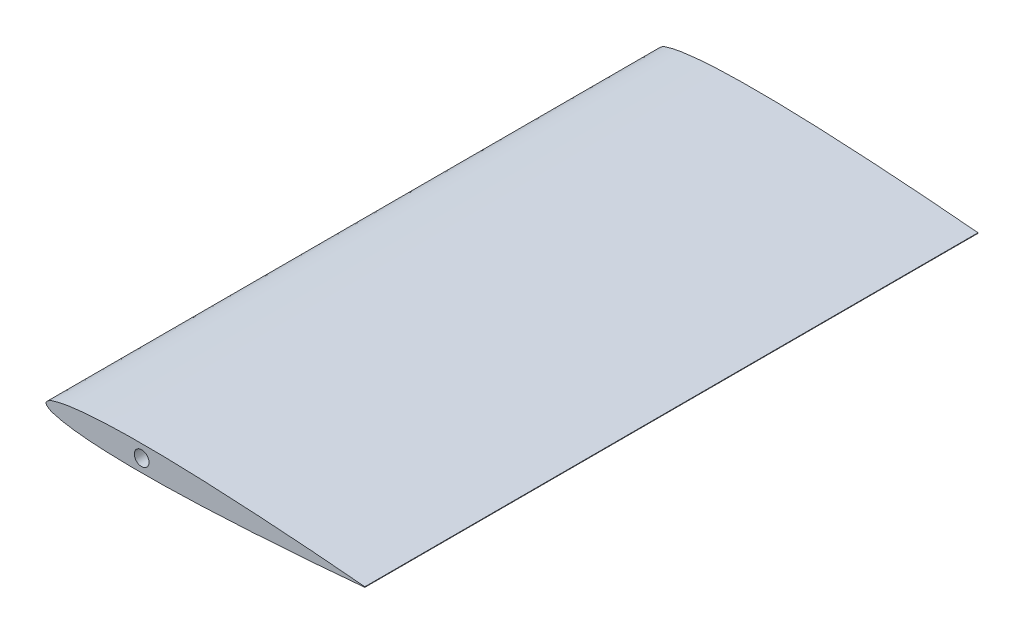
ISO-10303-21;
HEADER;
FILE_DESCRIPTION(('STEP AP214'),'2;1');
FILE_NAME('part.step','',(''),(''),'','','');
FILE_SCHEMA(('AUTOMOTIVE_DESIGN { 1 0 10303 214 1 1 1 1 }'));
ENDSEC;
DATA;
#1=APPLICATION_CONTEXT('core data for automotive mechanical design processes');
#2=APPLICATION_PROTOCOL_DEFINITION('international standard','automotive_design',2000,#1);
#3=PRODUCT_CONTEXT('',#1,'mechanical');
#4=PRODUCT('Part','Part','',(#3));
#5=PRODUCT_RELATED_PRODUCT_CATEGORY('part','',(#4));
#6=PRODUCT_DEFINITION_FORMATION('','',#4);
#7=PRODUCT_DEFINITION_CONTEXT('part definition',#1,'design');
#8=PRODUCT_DEFINITION('design','',#6,#7);
#9=PRODUCT_DEFINITION_SHAPE('','',#8);
#10=(LENGTH_UNIT() NAMED_UNIT(*) SI_UNIT(.MILLI.,.METRE.));
#11=(NAMED_UNIT(*) PLANE_ANGLE_UNIT() SI_UNIT($,.RADIAN.));
#12=(NAMED_UNIT(*) SI_UNIT($,.STERADIAN.) SOLID_ANGLE_UNIT());
#13=UNCERTAINTY_MEASURE_WITH_UNIT(LENGTH_MEASURE(1.E-05),#10,'distance_accuracy_value','');
#14=(GEOMETRIC_REPRESENTATION_CONTEXT(3) GLOBAL_UNCERTAINTY_ASSIGNED_CONTEXT((#13)) GLOBAL_UNIT_ASSIGNED_CONTEXT((#10,
#11,#12)) REPRESENTATION_CONTEXT('',''));
#15=CARTESIAN_POINT('',(0.,0.,0.));
#16=DIRECTION('',(0.,0.,1.));
#17=DIRECTION('',(1.,0.,0.));
#18=AXIS2_PLACEMENT_3D('',#15,#16,#17);
#19=CARTESIAN_POINT('',(0.,0.,250.));
#20=DIRECTION('',(0.,0.,-1.));
#21=DIRECTION('',(-1.,0.,0.));
#22=AXIS2_PLACEMENT_3D('',#19,#20,#21);
#23=PLANE('',#22);
#24=CARTESIAN_POINT('',(130.,0.1092,250.));
#25=CARTESIAN_POINT('',(127.833535732673,0.307773960495471,250.));
#26=CARTESIAN_POINT('',(123.501553962715,0.70483510284993,250.));
#27=CARTESIAN_POINT('',(114.836215077916,1.4441092804009,250.));
#28=CARTESIAN_POINT('',(104.004308011327,2.29318220094174,250.));
#29=CARTESIAN_POINT('',(91.0038872870488,3.19523180319484,250.));
#30=CARTESIAN_POINT('',(78.0040316316683,3.98033953875171,250.));
#31=CARTESIAN_POINT('',(65.0039160190168,4.61810045351935,250.));
#32=CARTESIAN_POINT('',(52.0033851771133,5.07428379972299,250.));
#33=CARTESIAN_POINT('',(41.1670398833176,5.23263615462631,250.));
#34=CARTESIAN_POINT('',(32.498919095683,5.16938699199426,250.));
#35=CARTESIAN_POINT('',(25.9970698378604,4.99948673038458,250.));
#36=CARTESIAN_POINT('',(19.4913883897994,4.66978492459391,250.));
#37=CARTESIAN_POINT('',(14.0753700513261,4.20851819590792,250.));
#38=CARTESIAN_POINT('',(9.73578572850335,3.65819985102422,250.));
#39=CARTESIAN_POINT('',(6.49160363280204,3.12522619853072,250.));
#40=CARTESIAN_POINT('',(3.704548113085,2.42836025562077,250.));
#41=CARTESIAN_POINT('',(1.51499567764257,1.71739452299827,250.));
#42=CARTESIAN_POINT('',(-0.863985461217163,0.,250.));
#43=CARTESIAN_POINT('',(1.51499567764257,-1.71739452299826,250.));
#44=CARTESIAN_POINT('',(3.70454811308501,-2.42836025562078,250.));
#45=CARTESIAN_POINT('',(6.49160363280201,-3.12522619853071,250.));
#46=CARTESIAN_POINT('',(9.73578572850337,-3.65819985102422,250.));
#47=CARTESIAN_POINT('',(14.0753700513261,-4.20851819590792,250.));
#48=CARTESIAN_POINT('',(19.4913883897994,-4.66978492459391,250.));
#49=CARTESIAN_POINT('',(25.9970698378604,-4.99948673038458,250.));
#50=CARTESIAN_POINT('',(32.4989190956831,-5.16938699199426,250.));
#51=CARTESIAN_POINT('',(41.1670398833176,-5.2326361546263,250.));
#52=CARTESIAN_POINT('',(52.0033851771133,-5.07428379972299,250.));
#53=CARTESIAN_POINT('',(65.0039160190168,-4.61810045351935,250.));
#54=CARTESIAN_POINT('',(78.0040316316683,-3.98033953875171,250.));
#55=CARTESIAN_POINT('',(91.0038872870488,-3.19523180319484,250.));
#56=CARTESIAN_POINT('',(104.004308011327,-2.29318220094174,250.));
#57=CARTESIAN_POINT('',(114.836215077916,-1.4441092804009,250.));
#58=CARTESIAN_POINT('',(123.501553962715,-0.704835102849927,250.));
#59=CARTESIAN_POINT('',(127.833535732673,-0.30777396049547,250.));
#60=CARTESIAN_POINT('',(130.,-0.1092,250.));
#61=B_SPLINE_CURVE_WITH_KNOTS('',3,(#24,#25,#26,#27,#28,#29,#30,#31,#32,#33,#34,#35,#36,#37,#38,
#39,#40,#41,#42,#43,#44,#45,#46,#47,#48,#49,#50,#51,#52,#53,#54,#55,#56,#57,#58,#59,#60),
.UNSPECIFIED.,.F.,.F.,(4,1,1,1,1,1,1,1,1,1,1,1,1,1,1,1,1,1,1,1,1,1,1,1,1,1,1,1,1,1,1,1,1,1,4),
(0.,0.0248762804834874,0.0497416898049367,0.0994434417854954,0.149112186110492,
0.198750911327119,0.24835904696366,0.297937294403623,0.347491196880371,0.372266797678534,
0.397050685977697,0.421859363952799,0.446731256148464,0.459220209986021,0.471790159608865,
0.484560191242022,0.491194845973671,0.5,0.50880515402633,0.515439808757978,0.528209840391136,
0.540779790013979,0.553268743851536,0.578140636047201,0.602949314022304,0.627733202321466,
0.652508803119629,0.702062705596377,0.75164095303634,0.801249088672881,0.850887813889509,
0.900556558214505,0.950258310195063,0.975123719516513,1.),.UNSPECIFIED.);
#62=CARTESIAN_POINT('',(130.,0.1092,250.));
#63=VERTEX_POINT('',#62);
#64=CARTESIAN_POINT('',(130.,-0.1092,250.));
#65=VERTEX_POINT('',#64);
#66=EDGE_CURVE('E65',#63,#65,#61,.T.);
#67=ORIENTED_EDGE('',*,*,#66,.T.);
#68=DIRECTION('',(0.,1.,0.));
#69=VECTOR('',#68,1.);
#70=CARTESIAN_POINT('',(130.,0.1092,250.));
#71=LINE('',#70,#69);
#72=EDGE_CURVE('E50',#65,#63,#71,.T.);
#73=ORIENTED_EDGE('',*,*,#72,.T.);
#74=EDGE_LOOP('',(#67,#73));
#75=FACE_BOUND('',#74,.T.);
#76=CARTESIAN_POINT('',(38.99725692697,0.,250.));
#77=DIRECTION('',(0.,0.,1.));
#78=DIRECTION('',(1.,0.,0.));
#79=AXIS2_PLACEMENT_3D('',#76,#77,#78);
#80=CIRCLE('',#79,3.);
#81=CARTESIAN_POINT('',(41.99725692697,0.,250.));
#82=VERTEX_POINT('',#81);
#83=EDGE_CURVE('E71',#82,#82,#80,.T.);
#84=ORIENTED_EDGE('',*,*,#83,.F.);
#85=EDGE_LOOP('',(#84));
#86=FACE_BOUND('',#85,.T.);
#87=ADVANCED_FACE('F33',(#75,#86),#23,.F.);
#88=CARTESIAN_POINT('',(0.,0.,0.));
#89=DIRECTION('',(0.,0.,-1.));
#90=DIRECTION('',(-1.,0.,0.));
#91=AXIS2_PLACEMENT_3D('',#88,#89,#90);
#92=PLANE('',#91);
#93=CARTESIAN_POINT('',(130.,0.1092,0.));
#94=CARTESIAN_POINT('',(127.833535732673,0.307773960495471,0.));
#95=CARTESIAN_POINT('',(123.501553962715,0.70483510284993,0.));
#96=CARTESIAN_POINT('',(114.836215077916,1.4441092804009,0.));
#97=CARTESIAN_POINT('',(104.004308011327,2.29318220094174,0.));
#98=CARTESIAN_POINT('',(91.0038872870488,3.19523180319484,0.));
#99=CARTESIAN_POINT('',(78.0040316316683,3.98033953875171,0.));
#100=CARTESIAN_POINT('',(65.0039160190168,4.61810045351935,0.));
#101=CARTESIAN_POINT('',(52.0033851771133,5.07428379972299,0.));
#102=CARTESIAN_POINT('',(41.1670398833176,5.23263615462631,0.));
#103=CARTESIAN_POINT('',(32.498919095683,5.16938699199426,0.));
#104=CARTESIAN_POINT('',(25.9970698378604,4.99948673038458,0.));
#105=CARTESIAN_POINT('',(19.4913883897994,4.66978492459391,0.));
#106=CARTESIAN_POINT('',(14.0753700513261,4.20851819590792,0.));
#107=CARTESIAN_POINT('',(9.73578572850335,3.65819985102422,0.));
#108=CARTESIAN_POINT('',(6.49160363280204,3.12522619853072,0.));
#109=CARTESIAN_POINT('',(3.704548113085,2.42836025562077,0.));
#110=CARTESIAN_POINT('',(1.51499567764257,1.71739452299827,0.));
#111=CARTESIAN_POINT('',(-0.863985461217163,0.,0.));
#112=CARTESIAN_POINT('',(1.51499567764257,-1.71739452299826,0.));
#113=CARTESIAN_POINT('',(3.70454811308501,-2.42836025562078,0.));
#114=CARTESIAN_POINT('',(6.49160363280201,-3.12522619853071,0.));
#115=CARTESIAN_POINT('',(9.73578572850337,-3.65819985102422,0.));
#116=CARTESIAN_POINT('',(14.0753700513261,-4.20851819590792,0.));
#117=CARTESIAN_POINT('',(19.4913883897994,-4.66978492459391,0.));
#118=CARTESIAN_POINT('',(25.9970698378604,-4.99948673038458,0.));
#119=CARTESIAN_POINT('',(32.4989190956831,-5.16938699199426,0.));
#120=CARTESIAN_POINT('',(41.1670398833176,-5.2326361546263,0.));
#121=CARTESIAN_POINT('',(52.0033851771133,-5.07428379972299,0.));
#122=CARTESIAN_POINT('',(65.0039160190168,-4.61810045351935,0.));
#123=CARTESIAN_POINT('',(78.0040316316683,-3.98033953875171,0.));
#124=CARTESIAN_POINT('',(91.0038872870488,-3.19523180319484,0.));
#125=CARTESIAN_POINT('',(104.004308011327,-2.29318220094174,0.));
#126=CARTESIAN_POINT('',(114.836215077916,-1.4441092804009,0.));
#127=CARTESIAN_POINT('',(123.501553962715,-0.704835102849927,0.));
#128=CARTESIAN_POINT('',(127.833535732673,-0.30777396049547,0.));
#129=CARTESIAN_POINT('',(130.,-0.1092,0.));
#130=B_SPLINE_CURVE_WITH_KNOTS('',3,(#93,#94,#95,#96,#97,#98,#99,#100,#101,#102,#103,#104,#105,
#106,#107,#108,#109,#110,#111,#112,#113,#114,#115,#116,#117,#118,#119,#120,#121,#122,#123,#124,
#125,#126,#127,#128,#129),.UNSPECIFIED.,.F.,.F.,(4,1,1,1,1,1,1,1,1,1,1,1,1,1,1,1,1,1,1,1,1,1,1,
1,1,1,1,1,1,1,1,1,1,1,4),(0.,0.0248762804834874,0.0497416898049367,0.0994434417854954,
0.149112186110492,0.198750911327119,0.24835904696366,0.297937294403623,0.347491196880371,
0.372266797678534,0.397050685977697,0.421859363952799,0.446731256148464,0.459220209986021,
0.471790159608865,0.484560191242022,0.491194845973671,0.5,0.50880515402633,0.515439808757978,
0.528209840391136,0.540779790013979,0.553268743851536,0.578140636047201,0.602949314022304,
0.627733202321466,0.652508803119629,0.702062705596377,0.75164095303634,0.801249088672881,
0.850887813889509,0.900556558214505,0.950258310195063,0.975123719516513,1.),.UNSPECIFIED.);
#131=CARTESIAN_POINT('',(130.,0.1092,0.));
#132=VERTEX_POINT('',#131);
#133=CARTESIAN_POINT('',(130.,-0.1092,0.));
#134=VERTEX_POINT('',#133);
#135=EDGE_CURVE('E66',#132,#134,#130,.T.);
#136=ORIENTED_EDGE('',*,*,#135,.F.);
#137=DIRECTION('',(0.,1.,0.));
#138=VECTOR('',#137,1.);
#139=CARTESIAN_POINT('',(130.,0.1092,0.));
#140=LINE('',#139,#138);
#141=EDGE_CURVE('E58',#134,#132,#140,.T.);
#142=ORIENTED_EDGE('',*,*,#141,.F.);
#143=EDGE_LOOP('',(#136,#142));
#144=FACE_BOUND('',#143,.T.);
#145=CARTESIAN_POINT('',(38.99725692697,0.,0.));
#146=DIRECTION('',(0.,0.,1.));
#147=DIRECTION('',(1.,0.,0.));
#148=AXIS2_PLACEMENT_3D('',#145,#146,#147);
#149=CIRCLE('',#148,3.);
#150=CARTESIAN_POINT('',(41.99725692697,0.,0.));
#151=VERTEX_POINT('',#150);
#152=EDGE_CURVE('E74',#151,#151,#149,.T.);
#153=ORIENTED_EDGE('',*,*,#152,.T.);
#154=EDGE_LOOP('',(#153));
#155=FACE_BOUND('',#154,.T.);
#156=ADVANCED_FACE('F69',(#144,#155),#92,.T.);
#157=DIRECTION('',(0.,0.,-1.));
#158=VECTOR('',#157,1.);
#159=SURFACE_OF_LINEAR_EXTRUSION('',#61,#158);
#160=ORIENTED_EDGE('',*,*,#135,.T.);
#161=DIRECTION('',(0.,0.,-1.));
#162=VECTOR('',#161,1.);
#163=CARTESIAN_POINT('',(130.,-0.1092,250.));
#164=LINE('',#163,#162);
#165=EDGE_CURVE('E11',#65,#134,#164,.T.);
#166=ORIENTED_EDGE('',*,*,#165,.F.);
#167=ORIENTED_EDGE('',*,*,#66,.F.);
#168=DIRECTION('',(0.,0.,-1.));
#169=VECTOR('',#168,1.);
#170=CARTESIAN_POINT('',(130.,0.1092,250.));
#171=LINE('',#170,#169);
#172=EDGE_CURVE('E43',#63,#132,#171,.T.);
#173=ORIENTED_EDGE('',*,*,#172,.T.);
#174=EDGE_LOOP('',(#160,#166,#167,#173));
#175=FACE_BOUND('',#174,.T.);
#176=ADVANCED_FACE('F35',(#175),#159,.F.);
#177=CARTESIAN_POINT('',(130.,0.1092,250.));
#178=DIRECTION('',(-1.,0.,0.));
#179=DIRECTION('',(0.,0.,1.));
#180=AXIS2_PLACEMENT_3D('',#177,#178,#179);
#181=PLANE('',#180);
#182=ORIENTED_EDGE('',*,*,#141,.T.);
#183=ORIENTED_EDGE('',*,*,#172,.F.);
#184=ORIENTED_EDGE('',*,*,#72,.F.);
#185=ORIENTED_EDGE('',*,*,#165,.T.);
#186=EDGE_LOOP('',(#182,#183,#184,#185));
#187=FACE_BOUND('',#186,.T.);
#188=ADVANCED_FACE('F61',(#187),#181,.F.);
#189=CARTESIAN_POINT('',(38.99725692697,0.,250.));
#190=DIRECTION('',(0.,0.,-1.));
#191=DIRECTION('',(-1.,0.,0.));
#192=AXIS2_PLACEMENT_3D('',#189,#190,#191);
#193=CYLINDRICAL_SURFACE('',#192,3.);
#194=ORIENTED_EDGE('',*,*,#83,.T.);
#195=EDGE_LOOP('',(#194));
#196=FACE_BOUND('',#195,.T.);
#197=ORIENTED_EDGE('',*,*,#152,.F.);
#198=EDGE_LOOP('',(#197));
#199=FACE_BOUND('',#198,.T.);
#200=ADVANCED_FACE('F92',(#196,#199),#193,.F.);
#201=CLOSED_SHELL('',(#87,#156,#176,#188,#200));
#202=MANIFOLD_SOLID_BREP('B2',#201);
#203=ADVANCED_BREP_SHAPE_REPRESENTATION('',(#18,#202),#14);
#204=SHAPE_DEFINITION_REPRESENTATION(#9,#203);
ENDSEC;
END-ISO-10303-21;
